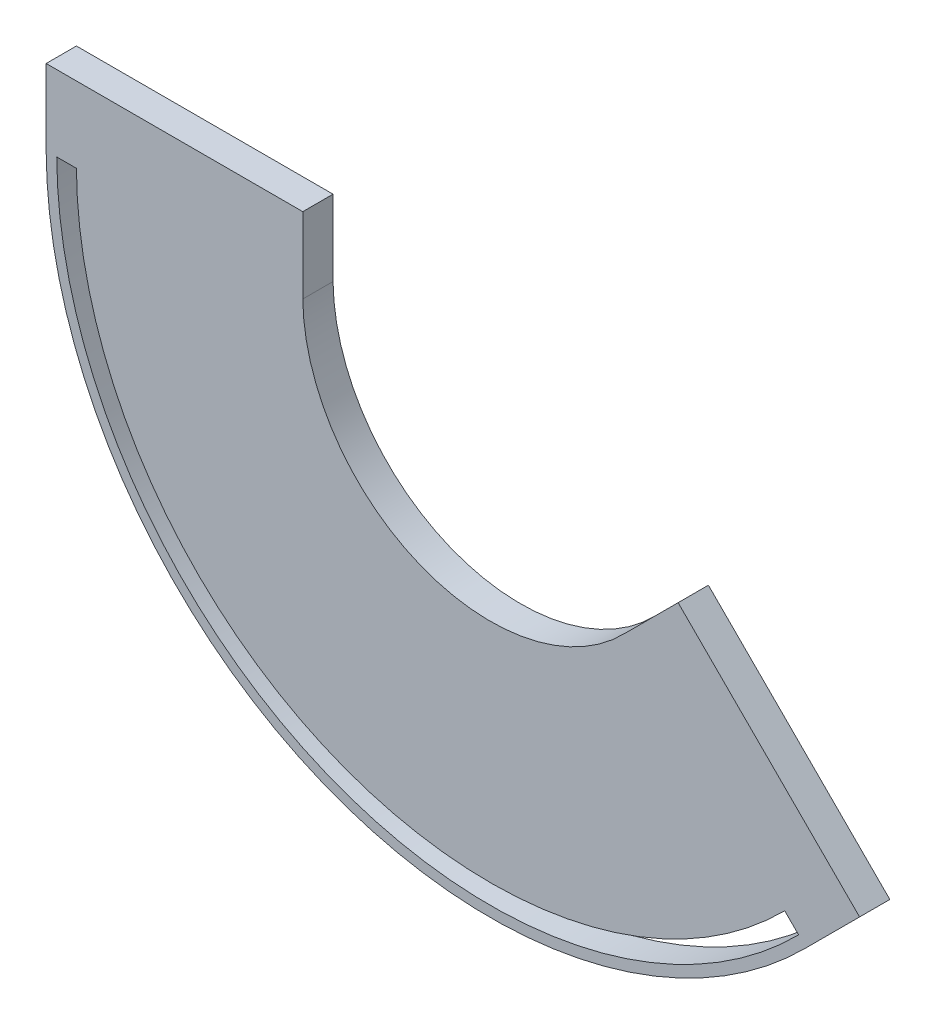
ISO-10303-21;
HEADER;
FILE_DESCRIPTION(('STEP AP214'),'2;1');
FILE_NAME('part.step','',(''),(''),'','','');
FILE_SCHEMA(('AUTOMOTIVE_DESIGN { 1 0 10303 214 1 1 1 1 }'));
ENDSEC;
DATA;
#1=APPLICATION_CONTEXT('core data for automotive mechanical design processes');
#2=APPLICATION_PROTOCOL_DEFINITION('international standard','automotive_design',2000,#1);
#3=PRODUCT_CONTEXT('',#1,'mechanical');
#4=PRODUCT('Part','Part','',(#3));
#5=PRODUCT_RELATED_PRODUCT_CATEGORY('part','',(#4));
#6=PRODUCT_DEFINITION_FORMATION('','',#4);
#7=PRODUCT_DEFINITION_CONTEXT('part definition',#1,'design');
#8=PRODUCT_DEFINITION('design','',#6,#7);
#9=PRODUCT_DEFINITION_SHAPE('','',#8);
#10=(LENGTH_UNIT() NAMED_UNIT(*) SI_UNIT(.MILLI.,.METRE.));
#11=(NAMED_UNIT(*) PLANE_ANGLE_UNIT() SI_UNIT($,.RADIAN.));
#12=(NAMED_UNIT(*) SI_UNIT($,.STERADIAN.) SOLID_ANGLE_UNIT());
#13=UNCERTAINTY_MEASURE_WITH_UNIT(LENGTH_MEASURE(1.E-05),#10,'distance_accuracy_value','');
#14=(GEOMETRIC_REPRESENTATION_CONTEXT(3) GLOBAL_UNCERTAINTY_ASSIGNED_CONTEXT((#13)) GLOBAL_UNIT_ASSIGNED_CONTEXT((#10,
#11,#12)) REPRESENTATION_CONTEXT('',''));
#15=CARTESIAN_POINT('',(0.,0.,0.));
#16=DIRECTION('',(0.,0.,1.));
#17=DIRECTION('',(1.,0.,0.));
#18=AXIS2_PLACEMENT_3D('',#15,#16,#17);
#19=CARTESIAN_POINT('',(0.,0.,5.08));
#20=DIRECTION('',(0.,0.,-1.));
#21=DIRECTION('',(-1.,0.,0.));
#22=AXIS2_PLACEMENT_3D('',#19,#20,#21);
#23=CYLINDRICAL_SURFACE('',#22,31.496);
#24=CARTESIAN_POINT('',(0.,0.,0.));
#25=DIRECTION('',(0.,0.,-1.));
#26=DIRECTION('',(1.,0.,0.));
#27=AXIS2_PLACEMENT_3D('',#24,#25,#26);
#28=CIRCLE('',#27,31.496);
#29=CARTESIAN_POINT('',(22.5377251884212,-22.001112683935,0.));
#30=VERTEX_POINT('',#29);
#31=CARTESIAN_POINT('',(-31.4937142857113,-0.379442340791523,0.));
#32=VERTEX_POINT('',#31);
#33=EDGE_CURVE('E154',#30,#32,#28,.T.);
#34=ORIENTED_EDGE('',*,*,#33,.T.);
#35=DIRECTION('',(0.,0.,-1.));
#36=VECTOR('',#35,1.);
#37=CARTESIAN_POINT('',(-31.4937142857113,-0.379442340791523,5.08));
#38=LINE('',#37,#36);
#39=CARTESIAN_POINT('',(-31.4937142857113,-0.379442340791523,5.08));
#40=VERTEX_POINT('',#39);
#41=EDGE_CURVE('E11',#40,#32,#38,.T.);
#42=ORIENTED_EDGE('',*,*,#41,.F.);
#43=CARTESIAN_POINT('',(0.,0.,5.08));
#44=DIRECTION('',(0.,0.,-1.));
#45=DIRECTION('',(1.,0.,0.));
#46=AXIS2_PLACEMENT_3D('',#43,#44,#45);
#47=CIRCLE('',#46,31.496);
#48=CARTESIAN_POINT('',(22.5377251884212,-22.001112683935,5.08));
#49=VERTEX_POINT('',#48);
#50=EDGE_CURVE('E158',#49,#40,#47,.T.);
#51=ORIENTED_EDGE('',*,*,#50,.F.);
#52=DIRECTION('',(0.,0.,-1.));
#53=VECTOR('',#52,1.);
#54=CARTESIAN_POINT('',(22.5377251884212,-22.001112683935,5.08));
#55=LINE('',#54,#53);
#56=EDGE_CURVE('E176',#49,#30,#55,.T.);
#57=ORIENTED_EDGE('',*,*,#56,.T.);
#58=EDGE_LOOP('',(#34,#42,#51,#57));
#59=FACE_BOUND('',#58,.T.);
#60=ADVANCED_FACE('F33',(#59),#23,.F.);
#61=CARTESIAN_POINT('',(-31.4937142857113,-0.379442340791523,5.08));
#62=DIRECTION('',(-1.,0.,0.));
#63=DIRECTION('',(0.,0.,1.));
#64=AXIS2_PLACEMENT_3D('',#61,#62,#63);
#65=PLANE('',#64);
#66=DIRECTION('',(0.,1.,0.));
#67=VECTOR('',#66,1.);
#68=CARTESIAN_POINT('',(-31.4937142857113,-0.379442340791523,0.));
#69=LINE('',#68,#67);
#70=CARTESIAN_POINT('',(-31.4937142857113,12.3205576592085,0.));
#71=VERTEX_POINT('',#70);
#72=EDGE_CURVE('E179',#32,#71,#69,.T.);
#73=ORIENTED_EDGE('',*,*,#72,.T.);
#74=DIRECTION('',(0.,0.,-1.));
#75=VECTOR('',#74,1.);
#76=CARTESIAN_POINT('',(-31.4937142857113,12.3205576592085,5.08));
#77=LINE('',#76,#75);
#78=CARTESIAN_POINT('',(-31.4937142857113,12.3205576592085,5.08));
#79=VERTEX_POINT('',#78);
#80=EDGE_CURVE('E40',#79,#71,#77,.T.);
#81=ORIENTED_EDGE('',*,*,#80,.F.);
#82=DIRECTION('',(0.,1.,0.));
#83=VECTOR('',#82,1.);
#84=CARTESIAN_POINT('',(-31.4937142857113,-0.379442340791523,5.08));
#85=LINE('',#84,#83);
#86=EDGE_CURVE('E161',#40,#79,#85,.T.);
#87=ORIENTED_EDGE('',*,*,#86,.F.);
#88=ORIENTED_EDGE('',*,*,#41,.T.);
#89=EDGE_LOOP('',(#73,#81,#87,#88));
#90=FACE_BOUND('',#89,.T.);
#91=ADVANCED_FACE('F234',(#90),#65,.F.);
#92=CARTESIAN_POINT('',(-74.5750346393202,12.3205576592085,5.08));
#93=DIRECTION('',(0.,-1.,0.));
#94=DIRECTION('',(0.,0.,-1.));
#95=AXIS2_PLACEMENT_3D('',#92,#93,#94);
#96=PLANE('',#95);
#97=DIRECTION('',(-1.,0.,0.));
#98=VECTOR('',#97,1.);
#99=CARTESIAN_POINT('',(-74.5750346393202,12.3205576592085,0.));
#100=LINE('',#99,#98);
#101=CARTESIAN_POINT('',(-74.5750346393202,12.3205576592085,0.));
#102=VERTEX_POINT('',#101);
#103=EDGE_CURVE('E181',#71,#102,#100,.T.);
#104=ORIENTED_EDGE('',*,*,#103,.T.);
#105=DIRECTION('',(0.,0.,-1.));
#106=VECTOR('',#105,1.);
#107=CARTESIAN_POINT('',(-74.5750346393202,12.3205576592085,5.08));
#108=LINE('',#107,#106);
#109=CARTESIAN_POINT('',(-74.5750346393202,12.3205576592085,5.08));
#110=VERTEX_POINT('',#109);
#111=EDGE_CURVE('E206',#110,#102,#108,.T.);
#112=ORIENTED_EDGE('',*,*,#111,.F.);
#113=DIRECTION('',(-1.,0.,0.));
#114=VECTOR('',#113,1.);
#115=CARTESIAN_POINT('',(-74.5750346393202,12.3205576592085,5.08));
#116=LINE('',#115,#114);
#117=EDGE_CURVE('E164',#79,#110,#116,.T.);
#118=ORIENTED_EDGE('',*,*,#117,.F.);
#119=ORIENTED_EDGE('',*,*,#80,.T.);
#120=EDGE_LOOP('',(#104,#112,#118,#119));
#121=FACE_BOUND('',#120,.T.);
#122=ADVANCED_FACE('F213',(#121),#96,.F.);
#123=CARTESIAN_POINT('',(-74.5750346393202,-0.379442340791523,5.08));
#124=DIRECTION('',(1.,0.,0.));
#125=DIRECTION('',(0.,0.,-1.));
#126=AXIS2_PLACEMENT_3D('',#123,#124,#125);
#127=PLANE('',#126);
#128=DIRECTION('',(0.,-1.,0.));
#129=VECTOR('',#128,1.);
#130=CARTESIAN_POINT('',(-74.5750346393202,-0.379442340791523,0.));
#131=LINE('',#130,#129);
#132=CARTESIAN_POINT('',(-74.5750346393202,-0.379442340791523,0.));
#133=VERTEX_POINT('',#132);
#134=EDGE_CURVE('E183',#102,#133,#131,.T.);
#135=ORIENTED_EDGE('',*,*,#134,.T.);
#136=DIRECTION('',(0.,0.,-1.));
#137=VECTOR('',#136,1.);
#138=CARTESIAN_POINT('',(-74.5750346393202,-0.379442340791523,5.08));
#139=LINE('',#138,#137);
#140=CARTESIAN_POINT('',(-74.5750346393202,-0.379442340791523,5.08));
#141=VERTEX_POINT('',#140);
#142=EDGE_CURVE('E203',#141,#133,#139,.T.);
#143=ORIENTED_EDGE('',*,*,#142,.F.);
#144=DIRECTION('',(0.,-1.,0.));
#145=VECTOR('',#144,1.);
#146=CARTESIAN_POINT('',(-74.5750346393202,-0.379442340791523,5.08));
#147=LINE('',#146,#145);
#148=EDGE_CURVE('E166',#110,#141,#147,.T.);
#149=ORIENTED_EDGE('',*,*,#148,.F.);
#150=ORIENTED_EDGE('',*,*,#111,.T.);
#151=EDGE_LOOP('',(#135,#143,#149,#150));
#152=FACE_BOUND('',#151,.T.);
#153=ADVANCED_FACE('F222',(#152),#127,.F.);
#154=CARTESIAN_POINT('',(0.,0.,5.08));
#155=DIRECTION('',(0.,0.,-1.));
#156=DIRECTION('',(-1.,0.,0.));
#157=AXIS2_PLACEMENT_3D('',#154,#155,#156);
#158=CYLINDRICAL_SURFACE('',#157,74.575999946);
#159=CARTESIAN_POINT('',(0.,0.,0.));
#160=DIRECTION('',(0.,0.,1.));
#161=DIRECTION('',(1.,0.,0.));
#162=AXIS2_PLACEMENT_3D('',#159,#160,#161);
#163=CIRCLE('',#162,74.575999946);
#164=CARTESIAN_POINT('',(53.0008189529282,-52.4642064484417,0.));
#165=VERTEX_POINT('',#164);
#166=EDGE_CURVE('E185',#133,#165,#163,.T.);
#167=ORIENTED_EDGE('',*,*,#166,.T.);
#168=DIRECTION('',(0.,0.,-1.));
#169=VECTOR('',#168,1.);
#170=CARTESIAN_POINT('',(53.0008189529282,-52.4642064484417,5.08));
#171=LINE('',#170,#169);
#172=CARTESIAN_POINT('',(53.0008189529282,-52.4642064484417,5.08));
#173=VERTEX_POINT('',#172);
#174=EDGE_CURVE('E200',#173,#165,#171,.T.);
#175=ORIENTED_EDGE('',*,*,#174,.F.);
#176=CARTESIAN_POINT('',(0.,0.,5.08));
#177=DIRECTION('',(0.,0.,1.));
#178=DIRECTION('',(1.,0.,0.));
#179=AXIS2_PLACEMENT_3D('',#176,#177,#178);
#180=CIRCLE('',#179,74.575999946);
#181=EDGE_CURVE('E168',#141,#173,#180,.T.);
#182=ORIENTED_EDGE('',*,*,#181,.F.);
#183=ORIENTED_EDGE('',*,*,#142,.T.);
#184=EDGE_LOOP('',(#167,#175,#182,#183));
#185=FACE_BOUND('',#184,.T.);
#186=ADVANCED_FACE('F226',(#185),#158,.T.);
#187=CARTESIAN_POINT('',(53.0008189529283,-52.4642064484417,5.08));
#188=DIRECTION('',(-0.707106781186552,0.707106781186543,0.));
#189=DIRECTION('',(-0.707106781186543,-0.707106781186552,0.));
#190=AXIS2_PLACEMENT_3D('',#187,#188,#189);
#191=PLANE('',#190);
#192=DIRECTION('',(0.707106781186543,0.707106781186552,0.));
#193=VECTOR('',#192,1.);
#194=CARTESIAN_POINT('',(53.0008189529283,-52.4642064484417,0.));
#195=LINE('',#194,#193);
#196=CARTESIAN_POINT('',(61.9810750739974,-43.4839503273725,0.));
#197=VERTEX_POINT('',#196);
#198=EDGE_CURVE('E187',#165,#197,#195,.T.);
#199=ORIENTED_EDGE('',*,*,#198,.T.);
#200=DIRECTION('',(0.,0.,-1.));
#201=VECTOR('',#200,1.);
#202=CARTESIAN_POINT('',(61.9810750739974,-43.4839503273725,5.08));
#203=LINE('',#202,#201);
#204=CARTESIAN_POINT('',(61.9810750739974,-43.4839503273725,5.08));
#205=VERTEX_POINT('',#204);
#206=EDGE_CURVE('E197',#205,#197,#203,.T.);
#207=ORIENTED_EDGE('',*,*,#206,.F.);
#208=DIRECTION('',(0.707106781186543,0.707106781186552,0.));
#209=VECTOR('',#208,1.);
#210=CARTESIAN_POINT('',(53.0008189529283,-52.4642064484417,5.08));
#211=LINE('',#210,#209);
#212=EDGE_CURVE('E170',#173,#205,#211,.T.);
#213=ORIENTED_EDGE('',*,*,#212,.F.);
#214=ORIENTED_EDGE('',*,*,#174,.T.);
#215=EDGE_LOOP('',(#199,#207,#213,#214));
#216=FACE_BOUND('',#215,.T.);
#217=ADVANCED_FACE('F247',(#216),#191,.F.);
#218=CARTESIAN_POINT('',(31.5179813094903,-13.0208565628658,5.08));
#219=DIRECTION('',(-0.707106781186543,-0.707106781186551,0.));
#220=DIRECTION('',(0.707106781186552,-0.707106781186544,0.));
#221=AXIS2_PLACEMENT_3D('',#218,#219,#220);
#222=PLANE('',#221);
#223=DIRECTION('',(-0.707106781186552,0.707106781186544,0.));
#224=VECTOR('',#223,1.);
#225=CARTESIAN_POINT('',(31.5179813094903,-13.0208565628658,0.));
#226=LINE('',#225,#224);
#227=CARTESIAN_POINT('',(31.5179813094903,-13.0208565628658,0.));
#228=VERTEX_POINT('',#227);
#229=EDGE_CURVE('E189',#197,#228,#226,.T.);
#230=ORIENTED_EDGE('',*,*,#229,.T.);
#231=DIRECTION('',(0.,0.,-1.));
#232=VECTOR('',#231,1.);
#233=CARTESIAN_POINT('',(31.5179813094903,-13.0208565628658,5.08));
#234=LINE('',#233,#232);
#235=CARTESIAN_POINT('',(31.5179813094903,-13.0208565628658,5.08));
#236=VERTEX_POINT('',#235);
#237=EDGE_CURVE('E194',#236,#228,#234,.T.);
#238=ORIENTED_EDGE('',*,*,#237,.F.);
#239=DIRECTION('',(-0.707106781186552,0.707106781186544,0.));
#240=VECTOR('',#239,1.);
#241=CARTESIAN_POINT('',(31.5179813094903,-13.0208565628658,5.08));
#242=LINE('',#241,#240);
#243=EDGE_CURVE('E172',#205,#236,#242,.T.);
#244=ORIENTED_EDGE('',*,*,#243,.F.);
#245=ORIENTED_EDGE('',*,*,#206,.T.);
#246=EDGE_LOOP('',(#230,#238,#244,#245));
#247=FACE_BOUND('',#246,.T.);
#248=ADVANCED_FACE('F245',(#247),#222,.F.);
#249=CARTESIAN_POINT('',(22.5377251884212,-22.001112683935,5.08));
#250=DIRECTION('',(0.707106781186552,-0.707106781186543,0.));
#251=DIRECTION('',(0.707106781186543,0.707106781186552,0.));
#252=AXIS2_PLACEMENT_3D('',#249,#250,#251);
#253=PLANE('',#252);
#254=DIRECTION('',(-0.707106781186543,-0.707106781186552,0.));
#255=VECTOR('',#254,1.);
#256=CARTESIAN_POINT('',(22.5377251884212,-22.001112683935,0.));
#257=LINE('',#256,#255);
#258=EDGE_CURVE('E162',#228,#30,#257,.T.);
#259=ORIENTED_EDGE('',*,*,#258,.T.);
#260=ORIENTED_EDGE('',*,*,#56,.F.);
#261=DIRECTION('',(-0.707106781186543,-0.707106781186552,0.));
#262=VECTOR('',#261,1.);
#263=CARTESIAN_POINT('',(22.5377251884212,-22.001112683935,5.08));
#264=LINE('',#263,#262);
#265=EDGE_CURVE('E174',#236,#49,#264,.T.);
#266=ORIENTED_EDGE('',*,*,#265,.F.);
#267=ORIENTED_EDGE('',*,*,#237,.T.);
#268=EDGE_LOOP('',(#259,#260,#266,#267));
#269=FACE_BOUND('',#268,.T.);
#270=ADVANCED_FACE('F240',(#269),#253,.F.);
#271=CARTESIAN_POINT('',(0.,0.,5.08));
#272=DIRECTION('',(0.,0.,1.));
#273=DIRECTION('',(1.,0.,0.));
#274=AXIS2_PLACEMENT_3D('',#271,#272,#273);
#275=PLANE('',#274);
#276=CARTESIAN_POINT('',(0.,0.,5.08));
#277=DIRECTION('',(0.,0.,-1.));
#278=DIRECTION('',(1.,0.,0.));
#279=AXIS2_PLACEMENT_3D('',#276,#277,#278);
#280=CIRCLE('',#279,69.495999946);
#281=CARTESIAN_POINT('',(49.4086666091053,-48.8720541046181,5.08));
#282=VERTEX_POINT('',#281);
#283=CARTESIAN_POINT('',(-69.494964076575,-0.379442340791528,5.08));
#284=VERTEX_POINT('',#283);
#285=EDGE_CURVE('E47',#282,#284,#280,.T.);
#286=ORIENTED_EDGE('',*,*,#285,.F.);
#287=DIRECTION('',(-0.70710678118656,0.707106781186535,0.));
#288=VECTOR('',#287,1.);
#289=CARTESIAN_POINT('',(49.4086666091053,-48.8720541046181,5.08));
#290=LINE('',#289,#288);
#291=CARTESIAN_POINT('',(51.7435664247179,-51.2069539202306,5.08));
#292=VERTEX_POINT('',#291);
#293=EDGE_CURVE('E139',#292,#282,#290,.T.);
#294=ORIENTED_EDGE('',*,*,#293,.F.);
#295=CARTESIAN_POINT('',(0.,0.,5.08));
#296=DIRECTION('',(0.,0.,1.));
#297=DIRECTION('',(1.,0.,0.));
#298=AXIS2_PLACEMENT_3D('',#295,#296,#297);
#299=CIRCLE('',#298,72.797999946);
#300=CARTESIAN_POINT('',(-72.7970110625967,-0.379442340791528,5.08));
#301=VERTEX_POINT('',#300);
#302=EDGE_CURVE('E142',#301,#292,#299,.T.);
#303=ORIENTED_EDGE('',*,*,#302,.F.);
#304=DIRECTION('',(-1.,0.,0.));
#305=VECTOR('',#304,1.);
#306=CARTESIAN_POINT('',(-72.7970110625967,-0.379442340791528,5.08));
#307=LINE('',#306,#305);
#308=EDGE_CURVE('E148',#284,#301,#307,.T.);
#309=ORIENTED_EDGE('',*,*,#308,.F.);
#310=EDGE_LOOP('',(#286,#294,#303,#309));
#311=FACE_BOUND('',#310,.T.);
#312=ORIENTED_EDGE('',*,*,#50,.T.);
#313=ORIENTED_EDGE('',*,*,#86,.T.);
#314=ORIENTED_EDGE('',*,*,#117,.T.);
#315=ORIENTED_EDGE('',*,*,#148,.T.);
#316=ORIENTED_EDGE('',*,*,#181,.T.);
#317=ORIENTED_EDGE('',*,*,#212,.T.);
#318=ORIENTED_EDGE('',*,*,#243,.T.);
#319=ORIENTED_EDGE('',*,*,#265,.T.);
#320=EDGE_LOOP('',(#312,#313,#314,#315,#316,#317,#318,#319));
#321=FACE_BOUND('',#320,.T.);
#322=ADVANCED_FACE('F230',(#311,#321),#275,.T.);
#323=CARTESIAN_POINT('',(0.,0.,0.));
#324=DIRECTION('',(0.,0.,1.));
#325=DIRECTION('',(1.,0.,0.));
#326=AXIS2_PLACEMENT_3D('',#323,#324,#325);
#327=PLANE('',#326);
#328=DIRECTION('',(-0.70710678118656,0.707106781186535,0.));
#329=VECTOR('',#328,1.);
#330=CARTESIAN_POINT('',(49.4086666091053,-48.8720541046181,0.));
#331=LINE('',#330,#329);
#332=CARTESIAN_POINT('',(51.7435664247179,-51.2069539202306,0.));
#333=VERTEX_POINT('',#332);
#334=CARTESIAN_POINT('',(49.4086666091053,-48.8720541046181,0.));
#335=VERTEX_POINT('',#334);
#336=EDGE_CURVE('E129',#333,#335,#331,.T.);
#337=ORIENTED_EDGE('',*,*,#336,.T.);
#338=CARTESIAN_POINT('',(0.,0.,0.));
#339=DIRECTION('',(0.,0.,-1.));
#340=DIRECTION('',(1.,0.,0.));
#341=AXIS2_PLACEMENT_3D('',#338,#339,#340);
#342=CIRCLE('',#341,69.495999946);
#343=CARTESIAN_POINT('',(-69.494964076575,-0.379442340791528,0.));
#344=VERTEX_POINT('',#343);
#345=EDGE_CURVE('E123',#335,#344,#342,.T.);
#346=ORIENTED_EDGE('',*,*,#345,.T.);
#347=DIRECTION('',(-1.,0.,0.));
#348=VECTOR('',#347,1.);
#349=CARTESIAN_POINT('',(-72.7970110625967,-0.379442340791528,0.));
#350=LINE('',#349,#348);
#351=CARTESIAN_POINT('',(-72.7970110625967,-0.379442340791528,0.));
#352=VERTEX_POINT('',#351);
#353=EDGE_CURVE('E132',#344,#352,#350,.T.);
#354=ORIENTED_EDGE('',*,*,#353,.T.);
#355=CARTESIAN_POINT('',(0.,0.,0.));
#356=DIRECTION('',(0.,0.,1.));
#357=DIRECTION('',(1.,0.,0.));
#358=AXIS2_PLACEMENT_3D('',#355,#356,#357);
#359=CIRCLE('',#358,72.797999946);
#360=EDGE_CURVE('E55',#352,#333,#359,.T.);
#361=ORIENTED_EDGE('',*,*,#360,.T.);
#362=EDGE_LOOP('',(#337,#346,#354,#361));
#363=FACE_BOUND('',#362,.T.);
#364=ORIENTED_EDGE('',*,*,#33,.F.);
#365=ORIENTED_EDGE('',*,*,#258,.F.);
#366=ORIENTED_EDGE('',*,*,#229,.F.);
#367=ORIENTED_EDGE('',*,*,#198,.F.);
#368=ORIENTED_EDGE('',*,*,#166,.F.);
#369=ORIENTED_EDGE('',*,*,#134,.F.);
#370=ORIENTED_EDGE('',*,*,#103,.F.);
#371=ORIENTED_EDGE('',*,*,#72,.F.);
#372=EDGE_LOOP('',(#364,#365,#366,#367,#368,#369,#370,#371));
#373=FACE_BOUND('',#372,.T.);
#374=ADVANCED_FACE('F136',(#363,#373),#327,.F.);
#375=CARTESIAN_POINT('',(0.,0.,0.));
#376=DIRECTION('',(0.,0.,1.));
#377=DIRECTION('',(1.,0.,0.));
#378=AXIS2_PLACEMENT_3D('',#375,#376,#377);
#379=CYLINDRICAL_SURFACE('',#378,69.495999946);
#380=ORIENTED_EDGE('',*,*,#285,.T.);
#381=DIRECTION('',(0.,0.,1.));
#382=VECTOR('',#381,1.);
#383=CARTESIAN_POINT('',(-69.494964076575,-0.379442340791528,0.));
#384=LINE('',#383,#382);
#385=EDGE_CURVE('E119',#344,#284,#384,.T.);
#386=ORIENTED_EDGE('',*,*,#385,.F.);
#387=ORIENTED_EDGE('',*,*,#345,.F.);
#388=DIRECTION('',(0.,0.,1.));
#389=VECTOR('',#388,1.);
#390=CARTESIAN_POINT('',(49.4086666091053,-48.8720541046181,0.));
#391=LINE('',#390,#389);
#392=EDGE_CURVE('E152',#335,#282,#391,.T.);
#393=ORIENTED_EDGE('',*,*,#392,.T.);
#394=EDGE_LOOP('',(#380,#386,#387,#393));
#395=FACE_BOUND('',#394,.T.);
#396=ADVANCED_FACE('F121',(#395),#379,.T.);
#397=CARTESIAN_POINT('',(49.4086666091053,-48.8720541046181,0.));
#398=DIRECTION('',(0.707106781186535,0.70710678118656,0.));
#399=DIRECTION('',(-0.70710678118656,0.707106781186535,0.));
#400=AXIS2_PLACEMENT_3D('',#397,#398,#399);
#401=PLANE('',#400);
#402=ORIENTED_EDGE('',*,*,#293,.T.);
#403=ORIENTED_EDGE('',*,*,#392,.F.);
#404=ORIENTED_EDGE('',*,*,#336,.F.);
#405=DIRECTION('',(0.,0.,1.));
#406=VECTOR('',#405,1.);
#407=CARTESIAN_POINT('',(51.7435664247179,-51.2069539202306,0.));
#408=LINE('',#407,#406);
#409=EDGE_CURVE('E155',#333,#292,#408,.T.);
#410=ORIENTED_EDGE('',*,*,#409,.T.);
#411=EDGE_LOOP('',(#402,#403,#404,#410));
#412=FACE_BOUND('',#411,.T.);
#413=ADVANCED_FACE('F318',(#412),#401,.F.);
#414=CARTESIAN_POINT('',(0.,0.,0.));
#415=DIRECTION('',(0.,0.,1.));
#416=DIRECTION('',(1.,0.,0.));
#417=AXIS2_PLACEMENT_3D('',#414,#415,#416);
#418=CYLINDRICAL_SURFACE('',#417,72.797999946);
#419=ORIENTED_EDGE('',*,*,#302,.T.);
#420=ORIENTED_EDGE('',*,*,#409,.F.);
#421=ORIENTED_EDGE('',*,*,#360,.F.);
#422=DIRECTION('',(0.,0.,1.));
#423=VECTOR('',#422,1.);
#424=CARTESIAN_POINT('',(-72.7970110625967,-0.379442340791528,0.));
#425=LINE('',#424,#423);
#426=EDGE_CURVE('E128',#352,#301,#425,.T.);
#427=ORIENTED_EDGE('',*,*,#426,.T.);
#428=EDGE_LOOP('',(#419,#420,#421,#427));
#429=FACE_BOUND('',#428,.T.);
#430=ADVANCED_FACE('F327',(#429),#418,.F.);
#431=CARTESIAN_POINT('',(-72.7970110625967,-0.379442340791528,0.));
#432=DIRECTION('',(0.,1.,0.));
#433=DIRECTION('',(-1.,0.,0.));
#434=AXIS2_PLACEMENT_3D('',#431,#432,#433);
#435=PLANE('',#434);
#436=ORIENTED_EDGE('',*,*,#308,.T.);
#437=ORIENTED_EDGE('',*,*,#426,.F.);
#438=ORIENTED_EDGE('',*,*,#353,.F.);
#439=ORIENTED_EDGE('',*,*,#385,.T.);
#440=EDGE_LOOP('',(#436,#437,#438,#439));
#441=FACE_BOUND('',#440,.T.);
#442=ADVANCED_FACE('F133',(#441),#435,.F.);
#443=CLOSED_SHELL('',(#60,#91,#122,#153,#186,#217,#248,#270,#322,#374,#396,#413,#430,#442));
#444=MANIFOLD_SOLID_BREP('B2',#443);
#445=ADVANCED_BREP_SHAPE_REPRESENTATION('',(#18,#444),#14);
#446=SHAPE_DEFINITION_REPRESENTATION(#9,#445);
ENDSEC;
END-ISO-10303-21;
